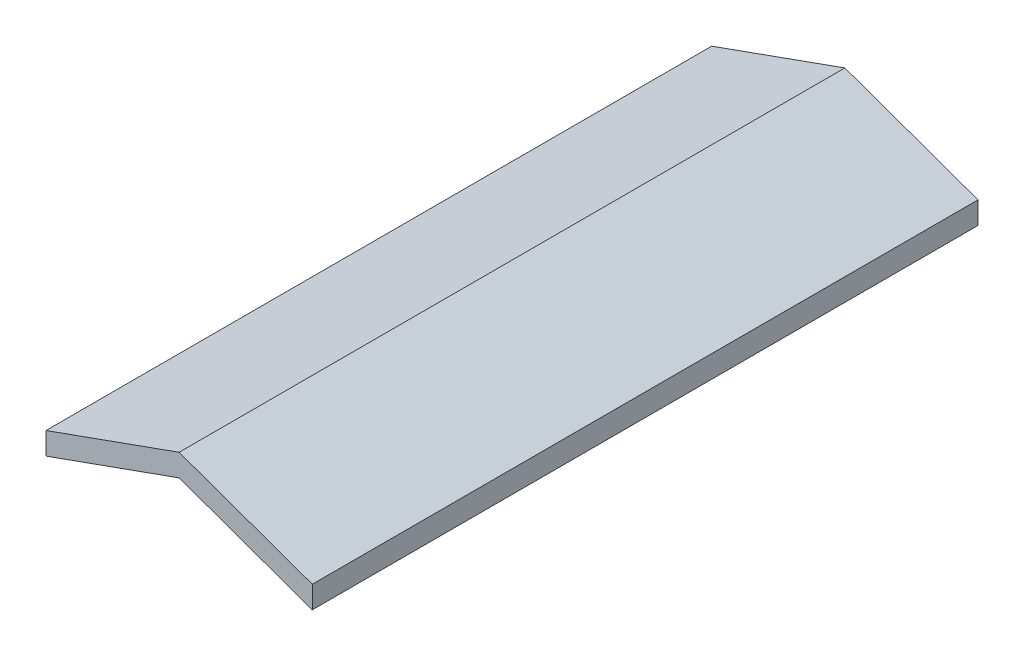
ISO-10303-21;
HEADER;
FILE_DESCRIPTION(('STEP AP214'),'2;1');
FILE_NAME('part.step','',(''),(''),'','','');
FILE_SCHEMA(('AUTOMOTIVE_DESIGN { 1 0 10303 214 1 1 1 1 }'));
ENDSEC;
DATA;
#1=APPLICATION_CONTEXT('core data for automotive mechanical design processes');
#2=APPLICATION_PROTOCOL_DEFINITION('international standard','automotive_design',2000,#1);
#3=PRODUCT_CONTEXT('',#1,'mechanical');
#4=PRODUCT('Part','Part','',(#3));
#5=PRODUCT_RELATED_PRODUCT_CATEGORY('part','',(#4));
#6=PRODUCT_DEFINITION_FORMATION('','',#4);
#7=PRODUCT_DEFINITION_CONTEXT('part definition',#1,'design');
#8=PRODUCT_DEFINITION('design','',#6,#7);
#9=PRODUCT_DEFINITION_SHAPE('','',#8);
#10=(LENGTH_UNIT() NAMED_UNIT(*) SI_UNIT(.MILLI.,.METRE.));
#11=(NAMED_UNIT(*) PLANE_ANGLE_UNIT() SI_UNIT($,.RADIAN.));
#12=(NAMED_UNIT(*) SI_UNIT($,.STERADIAN.) SOLID_ANGLE_UNIT());
#13=UNCERTAINTY_MEASURE_WITH_UNIT(LENGTH_MEASURE(1.E-05),#10,'distance_accuracy_value','');
#14=(GEOMETRIC_REPRESENTATION_CONTEXT(3) GLOBAL_UNCERTAINTY_ASSIGNED_CONTEXT((#13)) GLOBAL_UNIT_ASSIGNED_CONTEXT((#10,
#11,#12)) REPRESENTATION_CONTEXT('',''));
#15=CARTESIAN_POINT('',(0.,0.,0.));
#16=DIRECTION('',(0.,0.,1.));
#17=DIRECTION('',(1.,0.,0.));
#18=AXIS2_PLACEMENT_3D('',#15,#16,#17);
#19=CARTESIAN_POINT('',(6000.,-2150.,30000.));
#20=DIRECTION('',(-0.33733013198604,-0.941386414844765,0.));
#21=DIRECTION('',(0.941386414844765,-0.337330131986041,0.));
#22=AXIS2_PLACEMENT_3D('',#19,#20,#21);
#23=PLANE('',#22);
#24=DIRECTION('',(-0.941386414844765,0.33733013198604,0.));
#25=VECTOR('',#24,1.);
#26=CARTESIAN_POINT('',(6000.,-2150.,0.));
#27=LINE('',#26,#25);
#28=CARTESIAN_POINT('',(6000.,-2150.,0.));
#29=VERTEX_POINT('',#28);
#30=CARTESIAN_POINT('',(0.,0.,0.));
#31=VERTEX_POINT('',#30);
#32=EDGE_CURVE('E117',#29,#31,#27,.T.);
#33=ORIENTED_EDGE('',*,*,#32,.T.);
#34=DIRECTION('',(0.,0.,-1.));
#35=VECTOR('',#34,1.);
#36=CARTESIAN_POINT('',(0.,0.,30000.));
#37=LINE('',#36,#35);
#38=CARTESIAN_POINT('',(0.,0.,30000.));
#39=VERTEX_POINT('',#38);
#40=EDGE_CURVE('E11',#39,#31,#37,.T.);
#41=ORIENTED_EDGE('',*,*,#40,.F.);
#42=DIRECTION('',(-0.941386414844765,0.33733013198604,0.));
#43=VECTOR('',#42,1.);
#44=CARTESIAN_POINT('',(6000.,-2150.,30000.));
#45=LINE('',#44,#43);
#46=CARTESIAN_POINT('',(6000.,-2150.,30000.));
#47=VERTEX_POINT('',#46);
#48=EDGE_CURVE('E127',#47,#39,#45,.T.);
#49=ORIENTED_EDGE('',*,*,#48,.F.);
#50=DIRECTION('',(0.,0.,-1.));
#51=VECTOR('',#50,1.);
#52=CARTESIAN_POINT('',(6000.,-2150.,30000.));
#53=LINE('',#52,#51);
#54=EDGE_CURVE('E113',#47,#29,#53,.T.);
#55=ORIENTED_EDGE('',*,*,#54,.T.);
#56=EDGE_LOOP('',(#33,#41,#49,#55));
#57=FACE_BOUND('',#56,.T.);
#58=ADVANCED_FACE('F33',(#57),#23,.F.);
#59=CARTESIAN_POINT('',(0.,0.,30000.));
#60=DIRECTION('',(0.337330131986041,-0.941386414844765,0.));
#61=DIRECTION('',(0.941386414844765,0.337330131986041,0.));
#62=AXIS2_PLACEMENT_3D('',#59,#60,#61);
#63=PLANE('',#62);
#64=DIRECTION('',(-0.941386414844765,-0.337330131986041,0.));
#65=VECTOR('',#64,1.);
#66=CARTESIAN_POINT('',(0.,0.,0.));
#67=LINE('',#66,#65);
#68=CARTESIAN_POINT('',(-6000.,-2150.,0.));
#69=VERTEX_POINT('',#68);
#70=EDGE_CURVE('E120',#31,#69,#67,.T.);
#71=ORIENTED_EDGE('',*,*,#70,.T.);
#72=DIRECTION('',(0.,0.,-1.));
#73=VECTOR('',#72,1.);
#74=CARTESIAN_POINT('',(-6000.,-2150.,30000.));
#75=LINE('',#74,#73);
#76=CARTESIAN_POINT('',(-6000.,-2150.,30000.));
#77=VERTEX_POINT('',#76);
#78=EDGE_CURVE('E41',#77,#69,#75,.T.);
#79=ORIENTED_EDGE('',*,*,#78,.F.);
#80=DIRECTION('',(-0.941386414844765,-0.337330131986041,0.));
#81=VECTOR('',#80,1.);
#82=CARTESIAN_POINT('',(0.,0.,30000.));
#83=LINE('',#82,#81);
#84=EDGE_CURVE('E86',#39,#77,#83,.T.);
#85=ORIENTED_EDGE('',*,*,#84,.F.);
#86=ORIENTED_EDGE('',*,*,#40,.T.);
#87=EDGE_LOOP('',(#71,#79,#85,#86));
#88=FACE_BOUND('',#87,.T.);
#89=ADVANCED_FACE('F151',(#88),#63,.F.);
#90=CARTESIAN_POINT('',(-6000.,-2150.,30000.));
#91=DIRECTION('',(1.,0.,0.));
#92=DIRECTION('',(0.,0.,-1.));
#93=AXIS2_PLACEMENT_3D('',#90,#91,#92);
#94=PLANE('',#93);
#95=DIRECTION('',(0.,-1.,0.));
#96=VECTOR('',#95,1.);
#97=CARTESIAN_POINT('',(-6000.,-2150.,0.));
#98=LINE('',#97,#96);
#99=CARTESIAN_POINT('',(-6000.,-3150.,0.));
#100=VERTEX_POINT('',#99);
#101=EDGE_CURVE('E122',#69,#100,#98,.T.);
#102=ORIENTED_EDGE('',*,*,#101,.T.);
#103=DIRECTION('',(0.,0.,-1.));
#104=VECTOR('',#103,1.);
#105=CARTESIAN_POINT('',(-6000.,-3150.,30000.));
#106=LINE('',#105,#104);
#107=CARTESIAN_POINT('',(-6000.,-3150.,30000.));
#108=VERTEX_POINT('',#107);
#109=EDGE_CURVE('E108',#108,#100,#106,.T.);
#110=ORIENTED_EDGE('',*,*,#109,.F.);
#111=DIRECTION('',(0.,-1.,0.));
#112=VECTOR('',#111,1.);
#113=CARTESIAN_POINT('',(-6000.,-2150.,30000.));
#114=LINE('',#113,#112);
#115=EDGE_CURVE('E99',#77,#108,#114,.T.);
#116=ORIENTED_EDGE('',*,*,#115,.F.);
#117=ORIENTED_EDGE('',*,*,#78,.T.);
#118=EDGE_LOOP('',(#102,#110,#116,#117));
#119=FACE_BOUND('',#118,.T.);
#120=ADVANCED_FACE('F133',(#119),#94,.F.);
#121=CARTESIAN_POINT('',(-6000.,-3150.,30000.));
#122=DIRECTION('',(-0.337330131986041,0.941386414844765,0.));
#123=DIRECTION('',(-0.941386414844765,-0.337330131986041,0.));
#124=AXIS2_PLACEMENT_3D('',#121,#122,#123);
#125=PLANE('',#124);
#126=DIRECTION('',(0.941386414844765,0.337330131986041,0.));
#127=VECTOR('',#126,1.);
#128=CARTESIAN_POINT('',(-6000.,-3150.,0.));
#129=LINE('',#128,#127);
#130=CARTESIAN_POINT('',(1.11022302462516E-13,-1000.,0.));
#131=VERTEX_POINT('',#130);
#132=EDGE_CURVE('E107',#100,#131,#129,.T.);
#133=ORIENTED_EDGE('',*,*,#132,.T.);
#134=DIRECTION('',(0.,0.,-1.));
#135=VECTOR('',#134,1.);
#136=CARTESIAN_POINT('',(1.11022302462516E-13,-1000.,30000.));
#137=LINE('',#136,#135);
#138=CARTESIAN_POINT('',(1.11022302462516E-13,-1000.,30000.));
#139=VERTEX_POINT('',#138);
#140=EDGE_CURVE('E104',#139,#131,#137,.T.);
#141=ORIENTED_EDGE('',*,*,#140,.F.);
#142=DIRECTION('',(0.941386414844765,0.337330131986041,0.));
#143=VECTOR('',#142,1.);
#144=CARTESIAN_POINT('',(-6000.,-3150.,30000.));
#145=LINE('',#144,#143);
#146=EDGE_CURVE('E93',#108,#139,#145,.T.);
#147=ORIENTED_EDGE('',*,*,#146,.F.);
#148=ORIENTED_EDGE('',*,*,#109,.T.);
#149=EDGE_LOOP('',(#133,#141,#147,#148));
#150=FACE_BOUND('',#149,.T.);
#151=ADVANCED_FACE('F105',(#150),#125,.F.);
#152=CARTESIAN_POINT('',(1.11022302462516E-13,-1000.,30000.));
#153=DIRECTION('',(0.33733013198604,0.941386414844765,0.));
#154=DIRECTION('',(-0.941386414844765,0.337330131986041,0.));
#155=AXIS2_PLACEMENT_3D('',#152,#153,#154);
#156=PLANE('',#155);
#157=DIRECTION('',(0.941386414844765,-0.33733013198604,0.));
#158=VECTOR('',#157,1.);
#159=CARTESIAN_POINT('',(1.11022302462516E-13,-1000.,0.));
#160=LINE('',#159,#158);
#161=CARTESIAN_POINT('',(6000.,-3150.,0.));
#162=VERTEX_POINT('',#161);
#163=EDGE_CURVE('E72',#131,#162,#160,.T.);
#164=ORIENTED_EDGE('',*,*,#163,.T.);
#165=DIRECTION('',(0.,0.,-1.));
#166=VECTOR('',#165,1.);
#167=CARTESIAN_POINT('',(6000.,-3150.,30000.));
#168=LINE('',#167,#166);
#169=CARTESIAN_POINT('',(6000.,-3150.,30000.));
#170=VERTEX_POINT('',#169);
#171=EDGE_CURVE('E109',#170,#162,#168,.T.);
#172=ORIENTED_EDGE('',*,*,#171,.F.);
#173=DIRECTION('',(0.941386414844765,-0.33733013198604,0.));
#174=VECTOR('',#173,1.);
#175=CARTESIAN_POINT('',(1.11022302462516E-13,-1000.,30000.));
#176=LINE('',#175,#174);
#177=EDGE_CURVE('E97',#139,#170,#176,.T.);
#178=ORIENTED_EDGE('',*,*,#177,.F.);
#179=ORIENTED_EDGE('',*,*,#140,.T.);
#180=EDGE_LOOP('',(#164,#172,#178,#179));
#181=FACE_BOUND('',#180,.T.);
#182=ADVANCED_FACE('F111',(#181),#156,.F.);
#183=CARTESIAN_POINT('',(6000.,-3150.,30000.));
#184=DIRECTION('',(-1.,0.,0.));
#185=DIRECTION('',(0.,0.,1.));
#186=AXIS2_PLACEMENT_3D('',#183,#184,#185);
#187=PLANE('',#186);
#188=DIRECTION('',(0.,1.,0.));
#189=VECTOR('',#188,1.);
#190=CARTESIAN_POINT('',(6000.,-3150.,0.));
#191=LINE('',#190,#189);
#192=EDGE_CURVE('E78',#162,#29,#191,.T.);
#193=ORIENTED_EDGE('',*,*,#192,.T.);
#194=ORIENTED_EDGE('',*,*,#54,.F.);
#195=DIRECTION('',(0.,1.,0.));
#196=VECTOR('',#195,1.);
#197=CARTESIAN_POINT('',(6000.,-3150.,30000.));
#198=LINE('',#197,#196);
#199=EDGE_CURVE('E49',#170,#47,#198,.T.);
#200=ORIENTED_EDGE('',*,*,#199,.F.);
#201=ORIENTED_EDGE('',*,*,#171,.T.);
#202=EDGE_LOOP('',(#193,#194,#200,#201));
#203=FACE_BOUND('',#202,.T.);
#204=ADVANCED_FACE('F140',(#203),#187,.F.);
#205=CARTESIAN_POINT('',(0.,0.,30000.));
#206=DIRECTION('',(0.,0.,1.));
#207=DIRECTION('',(1.,0.,0.));
#208=AXIS2_PLACEMENT_3D('',#205,#206,#207);
#209=PLANE('',#208);
#210=ORIENTED_EDGE('',*,*,#48,.T.);
#211=ORIENTED_EDGE('',*,*,#84,.T.);
#212=ORIENTED_EDGE('',*,*,#115,.T.);
#213=ORIENTED_EDGE('',*,*,#146,.T.);
#214=ORIENTED_EDGE('',*,*,#177,.T.);
#215=ORIENTED_EDGE('',*,*,#199,.T.);
#216=EDGE_LOOP('',(#210,#211,#212,#213,#214,#215));
#217=FACE_BOUND('',#216,.T.);
#218=ADVANCED_FACE('F95',(#217),#209,.T.);
#219=CARTESIAN_POINT('',(0.,0.,0.));
#220=DIRECTION('',(0.,0.,1.));
#221=DIRECTION('',(1.,0.,0.));
#222=AXIS2_PLACEMENT_3D('',#219,#220,#221);
#223=PLANE('',#222);
#224=ORIENTED_EDGE('',*,*,#32,.F.);
#225=ORIENTED_EDGE('',*,*,#192,.F.);
#226=ORIENTED_EDGE('',*,*,#163,.F.);
#227=ORIENTED_EDGE('',*,*,#132,.F.);
#228=ORIENTED_EDGE('',*,*,#101,.F.);
#229=ORIENTED_EDGE('',*,*,#70,.F.);
#230=EDGE_LOOP('',(#224,#225,#226,#227,#228,#229));
#231=FACE_BOUND('',#230,.T.);
#232=ADVANCED_FACE('F136',(#231),#223,.F.);
#233=CLOSED_SHELL('',(#58,#89,#120,#151,#182,#204,#218,#232));
#234=MANIFOLD_SOLID_BREP('B2',#233);
#235=ADVANCED_BREP_SHAPE_REPRESENTATION('',(#18,#234),#14);
#236=SHAPE_DEFINITION_REPRESENTATION(#9,#235);
ENDSEC;
END-ISO-10303-21;
